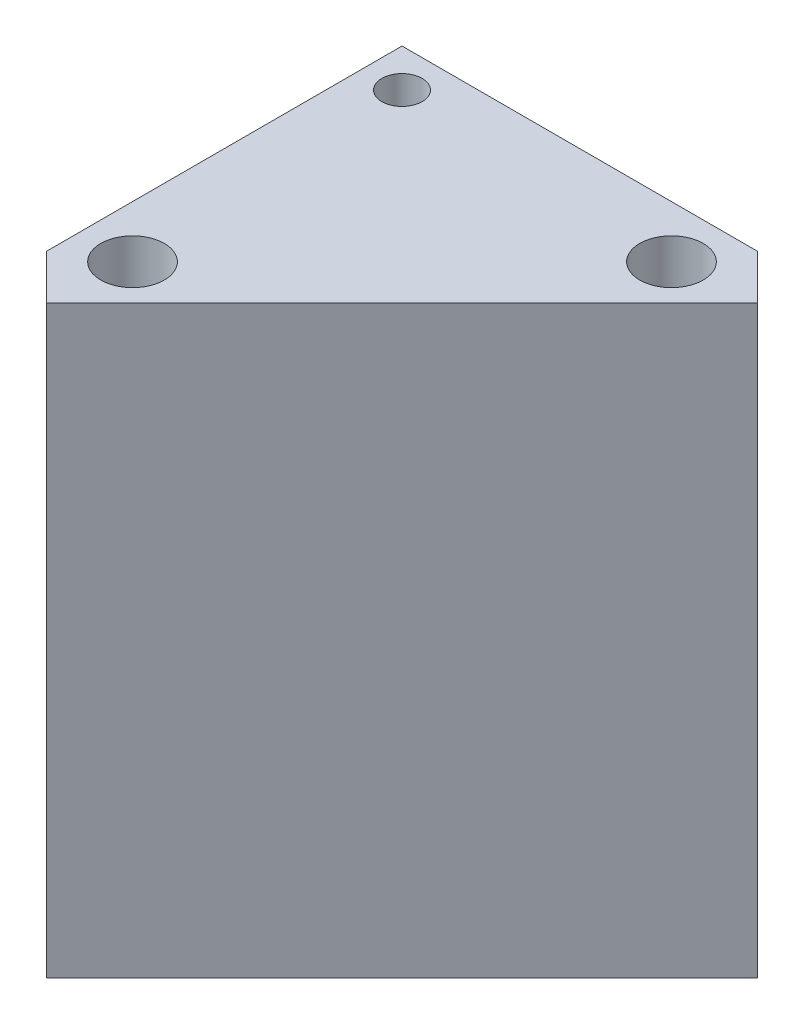
ISO-10303-21;
HEADER;
FILE_DESCRIPTION(('STEP AP214'),'2;1');
FILE_NAME('part.step','',(''),(''),'','','');
FILE_SCHEMA(('AUTOMOTIVE_DESIGN { 1 0 10303 214 1 1 1 1 }'));
ENDSEC;
DATA;
#1=APPLICATION_CONTEXT('core data for automotive mechanical design processes');
#2=APPLICATION_PROTOCOL_DEFINITION('international standard','automotive_design',2000,#1);
#3=PRODUCT_CONTEXT('',#1,'mechanical');
#4=PRODUCT('Part','Part','',(#3));
#5=PRODUCT_RELATED_PRODUCT_CATEGORY('part','',(#4));
#6=PRODUCT_DEFINITION_FORMATION('','',#4);
#7=PRODUCT_DEFINITION_CONTEXT('part definition',#1,'design');
#8=PRODUCT_DEFINITION('design','',#6,#7);
#9=PRODUCT_DEFINITION_SHAPE('','',#8);
#10=(LENGTH_UNIT() NAMED_UNIT(*) SI_UNIT(.MILLI.,.METRE.));
#11=(NAMED_UNIT(*) PLANE_ANGLE_UNIT() SI_UNIT($,.RADIAN.));
#12=(NAMED_UNIT(*) SI_UNIT($,.STERADIAN.) SOLID_ANGLE_UNIT());
#13=UNCERTAINTY_MEASURE_WITH_UNIT(LENGTH_MEASURE(1.E-05),#10,'distance_accuracy_value','');
#14=(GEOMETRIC_REPRESENTATION_CONTEXT(3) GLOBAL_UNCERTAINTY_ASSIGNED_CONTEXT((#13)) GLOBAL_UNIT_ASSIGNED_CONTEXT((#10,
#11,#12)) REPRESENTATION_CONTEXT('',''));
#15=CARTESIAN_POINT('',(0.,0.,0.));
#16=DIRECTION('',(0.,0.,1.));
#17=DIRECTION('',(1.,0.,0.));
#18=AXIS2_PLACEMENT_3D('',#15,#16,#17);
#19=CARTESIAN_POINT('',(0.,46.,0.));
#20=DIRECTION('',(0.,0.,1.));
#21=DIRECTION('',(1.,0.,0.));
#22=AXIS2_PLACEMENT_3D('',#19,#20,#21);
#23=PLANE('',#22);
#24=DIRECTION('',(0.,-1.,0.));
#25=VECTOR('',#24,1.);
#26=CARTESIAN_POINT('',(20.,41.,0.));
#27=LINE('',#26,#25);
#28=CARTESIAN_POINT('',(20.,41.,0.));
#29=VERTEX_POINT('',#28);
#30=CARTESIAN_POINT('',(20.,16.,0.));
#31=VERTEX_POINT('',#30);
#32=EDGE_CURVE('E322',#29,#31,#27,.T.);
#33=ORIENTED_EDGE('',*,*,#32,.F.);
#34=DIRECTION('',(1.,0.,0.));
#35=VECTOR('',#34,1.);
#36=CARTESIAN_POINT('',(0.,41.,0.));
#37=LINE('',#36,#35);
#38=CARTESIAN_POINT('',(0.,41.,0.));
#39=VERTEX_POINT('',#38);
#40=EDGE_CURVE('E313',#39,#29,#37,.T.);
#41=ORIENTED_EDGE('',*,*,#40,.F.);
#42=DIRECTION('',(0.,-1.,0.));
#43=VECTOR('',#42,1.);
#44=CARTESIAN_POINT('',(0.,46.,0.));
#45=LINE('',#44,#43);
#46=CARTESIAN_POINT('',(0.,46.,0.));
#47=VERTEX_POINT('',#46);
#48=EDGE_CURVE('E11',#47,#39,#45,.T.);
#49=ORIENTED_EDGE('',*,*,#48,.F.);
#50=DIRECTION('',(-1.,0.,0.));
#51=VECTOR('',#50,1.);
#52=CARTESIAN_POINT('',(0.,46.,0.));
#53=LINE('',#52,#51);
#54=CARTESIAN_POINT('',(28.,46.,0.));
#55=VERTEX_POINT('',#54);
#56=EDGE_CURVE('E131',#55,#47,#53,.T.);
#57=ORIENTED_EDGE('',*,*,#56,.F.);
#58=DIRECTION('',(0.,-1.,0.));
#59=VECTOR('',#58,1.);
#60=CARTESIAN_POINT('',(28.,46.,0.));
#61=LINE('',#60,#59);
#62=CARTESIAN_POINT('',(28.,0.,0.));
#63=VERTEX_POINT('',#62);
#64=EDGE_CURVE('E117',#55,#63,#61,.T.);
#65=ORIENTED_EDGE('',*,*,#64,.T.);
#66=DIRECTION('',(-1.,0.,0.));
#67=VECTOR('',#66,1.);
#68=CARTESIAN_POINT('',(0.,0.,0.));
#69=LINE('',#68,#67);
#70=CARTESIAN_POINT('',(0.,0.,0.));
#71=VERTEX_POINT('',#70);
#72=EDGE_CURVE('E121',#63,#71,#69,.T.);
#73=ORIENTED_EDGE('',*,*,#72,.T.);
#74=CARTESIAN_POINT('',(0.,16.,0.));
#75=VERTEX_POINT('',#74);
#76=EDGE_CURVE('E41',#75,#71,#45,.T.);
#77=ORIENTED_EDGE('',*,*,#76,.F.);
#78=DIRECTION('',(1.,0.,0.));
#79=VECTOR('',#78,1.);
#80=CARTESIAN_POINT('',(0.,16.,0.));
#81=LINE('',#80,#79);
#82=EDGE_CURVE('E48',#75,#31,#81,.T.);
#83=ORIENTED_EDGE('',*,*,#82,.T.);
#84=EDGE_LOOP('',(#33,#41,#49,#57,#65,#73,#77,#83));
#85=FACE_BOUND('',#84,.T.);
#86=ADVANCED_FACE('F33',(#85),#23,.F.);
#87=CARTESIAN_POINT('',(0.,46.,0.));
#88=DIRECTION('',(1.,0.,0.));
#89=DIRECTION('',(0.,0.,-1.));
#90=AXIS2_PLACEMENT_3D('',#87,#88,#89);
#91=PLANE('',#90);
#92=ORIENTED_EDGE('',*,*,#48,.T.);
#93=DIRECTION('',(0.,0.,-1.));
#94=VECTOR('',#93,1.);
#95=CARTESIAN_POINT('',(0.,41.,20.));
#96=LINE('',#95,#94);
#97=CARTESIAN_POINT('',(0.,41.,20.));
#98=VERTEX_POINT('',#97);
#99=EDGE_CURVE('E319',#98,#39,#96,.T.);
#100=ORIENTED_EDGE('',*,*,#99,.F.);
#101=DIRECTION('',(0.,-1.,0.));
#102=VECTOR('',#101,1.);
#103=CARTESIAN_POINT('',(0.,41.,20.));
#104=LINE('',#103,#102);
#105=CARTESIAN_POINT('',(0.,16.,20.));
#106=VERTEX_POINT('',#105);
#107=EDGE_CURVE('E125',#98,#106,#104,.T.);
#108=ORIENTED_EDGE('',*,*,#107,.T.);
#109=DIRECTION('',(0.,0.,-1.));
#110=VECTOR('',#109,1.);
#111=CARTESIAN_POINT('',(0.,16.,20.));
#112=LINE('',#111,#110);
#113=EDGE_CURVE('E138',#106,#75,#112,.T.);
#114=ORIENTED_EDGE('',*,*,#113,.T.);
#115=ORIENTED_EDGE('',*,*,#76,.T.);
#116=DIRECTION('',(0.,0.,1.));
#117=VECTOR('',#116,1.);
#118=CARTESIAN_POINT('',(0.,0.,0.));
#119=LINE('',#118,#117);
#120=CARTESIAN_POINT('',(0.,0.,28.));
#121=VERTEX_POINT('',#120);
#122=EDGE_CURVE('E124',#71,#121,#119,.T.);
#123=ORIENTED_EDGE('',*,*,#122,.T.);
#124=DIRECTION('',(0.,-1.,0.));
#125=VECTOR('',#124,1.);
#126=CARTESIAN_POINT('',(0.,46.,28.));
#127=LINE('',#126,#125);
#128=CARTESIAN_POINT('',(0.,46.,28.));
#129=VERTEX_POINT('',#128);
#130=EDGE_CURVE('E112',#129,#121,#127,.T.);
#131=ORIENTED_EDGE('',*,*,#130,.F.);
#132=DIRECTION('',(0.,0.,1.));
#133=VECTOR('',#132,1.);
#134=CARTESIAN_POINT('',(0.,46.,0.));
#135=LINE('',#134,#133);
#136=EDGE_CURVE('E89',#47,#129,#135,.T.);
#137=ORIENTED_EDGE('',*,*,#136,.F.);
#138=EDGE_LOOP('',(#92,#100,#108,#114,#115,#123,#131,#137));
#139=FACE_BOUND('',#138,.T.);
#140=ADVANCED_FACE('F136',(#139),#91,.F.);
#141=CARTESIAN_POINT('',(3.53553390593267,46.,31.5355339059327));
#142=DIRECTION('',(0.707106781186551,0.,-0.707106781186544));
#143=DIRECTION('',(-0.707106781186544,0.,-0.707106781186551));
#144=AXIS2_PLACEMENT_3D('',#141,#142,#143);
#145=PLANE('',#144);
#146=DIRECTION('',(0.707106781186544,0.,0.707106781186551));
#147=VECTOR('',#146,1.);
#148=CARTESIAN_POINT('',(3.53553390593267,0.,31.5355339059327));
#149=LINE('',#148,#147);
#150=CARTESIAN_POINT('',(3.53553390593267,0.,31.5355339059327));
#151=VERTEX_POINT('',#150);
#152=EDGE_CURVE('E109',#121,#151,#149,.T.);
#153=ORIENTED_EDGE('',*,*,#152,.T.);
#154=DIRECTION('',(0.,-1.,0.));
#155=VECTOR('',#154,1.);
#156=CARTESIAN_POINT('',(3.53553390593267,46.,31.5355339059327));
#157=LINE('',#156,#155);
#158=CARTESIAN_POINT('',(3.53553390593267,46.,31.5355339059327));
#159=VERTEX_POINT('',#158);
#160=EDGE_CURVE('E106',#159,#151,#157,.T.);
#161=ORIENTED_EDGE('',*,*,#160,.F.);
#162=DIRECTION('',(0.707106781186544,0.,0.707106781186551));
#163=VECTOR('',#162,1.);
#164=CARTESIAN_POINT('',(3.53553390593267,46.,31.5355339059327));
#165=LINE('',#164,#163);
#166=EDGE_CURVE('E96',#129,#159,#165,.T.);
#167=ORIENTED_EDGE('',*,*,#166,.F.);
#168=ORIENTED_EDGE('',*,*,#130,.T.);
#169=EDGE_LOOP('',(#153,#161,#167,#168));
#170=FACE_BOUND('',#169,.T.);
#171=ADVANCED_FACE('F107',(#170),#145,.F.);
#172=CARTESIAN_POINT('',(31.5355339059327,46.,3.53553390593274));
#173=DIRECTION('',(-0.707106781186546,0.,-0.707106781186549));
#174=DIRECTION('',(-0.707106781186549,0.,0.707106781186546));
#175=AXIS2_PLACEMENT_3D('',#172,#173,#174);
#176=PLANE('',#175);
#177=DIRECTION('',(0.707106781186549,0.,-0.707106781186546));
#178=VECTOR('',#177,1.);
#179=CARTESIAN_POINT('',(31.5355339059327,0.,3.53553390593274));
#180=LINE('',#179,#178);
#181=CARTESIAN_POINT('',(31.5355339059327,0.,3.53553390593274));
#182=VERTEX_POINT('',#181);
#183=EDGE_CURVE('E128',#151,#182,#180,.T.);
#184=ORIENTED_EDGE('',*,*,#183,.T.);
#185=DIRECTION('',(0.,-1.,0.));
#186=VECTOR('',#185,1.);
#187=CARTESIAN_POINT('',(31.5355339059327,46.,3.53553390593274));
#188=LINE('',#187,#186);
#189=CARTESIAN_POINT('',(31.5355339059327,46.,3.53553390593274));
#190=VERTEX_POINT('',#189);
#191=EDGE_CURVE('E113',#190,#182,#188,.T.);
#192=ORIENTED_EDGE('',*,*,#191,.F.);
#193=DIRECTION('',(0.707106781186549,0.,-0.707106781186546));
#194=VECTOR('',#193,1.);
#195=CARTESIAN_POINT('',(31.5355339059327,46.,3.53553390593274));
#196=LINE('',#195,#194);
#197=EDGE_CURVE('E100',#159,#190,#196,.T.);
#198=ORIENTED_EDGE('',*,*,#197,.F.);
#199=ORIENTED_EDGE('',*,*,#160,.T.);
#200=EDGE_LOOP('',(#184,#192,#198,#199));
#201=FACE_BOUND('',#200,.T.);
#202=ADVANCED_FACE('F115',(#201),#176,.F.);
#203=CARTESIAN_POINT('',(28.,46.,0.));
#204=DIRECTION('',(-0.707106781186548,0.,0.707106781186547));
#205=DIRECTION('',(0.707106781186547,0.,0.707106781186548));
#206=AXIS2_PLACEMENT_3D('',#203,#204,#205);
#207=PLANE('',#206);
#208=DIRECTION('',(-0.707106781186547,0.,-0.707106781186548));
#209=VECTOR('',#208,1.);
#210=CARTESIAN_POINT('',(28.,0.,0.));
#211=LINE('',#210,#209);
#212=EDGE_CURVE('E81',#182,#63,#211,.T.);
#213=ORIENTED_EDGE('',*,*,#212,.T.);
#214=ORIENTED_EDGE('',*,*,#64,.F.);
#215=DIRECTION('',(-0.707106781186547,0.,-0.707106781186548));
#216=VECTOR('',#215,1.);
#217=CARTESIAN_POINT('',(28.,46.,0.));
#218=LINE('',#217,#216);
#219=EDGE_CURVE('E57',#190,#55,#218,.T.);
#220=ORIENTED_EDGE('',*,*,#219,.F.);
#221=ORIENTED_EDGE('',*,*,#191,.T.);
#222=EDGE_LOOP('',(#213,#214,#220,#221));
#223=FACE_BOUND('',#222,.T.);
#224=ADVANCED_FACE('F146',(#223),#207,.F.);
#225=CARTESIAN_POINT('',(0.,46.,0.));
#226=DIRECTION('',(0.,-1.,0.));
#227=DIRECTION('',(0.,0.,-1.));
#228=AXIS2_PLACEMENT_3D('',#225,#226,#227);
#229=PLANE('',#228);
#230=CARTESIAN_POINT('',(4.10050506338827,46.,25.3137084989847));
#231=DIRECTION('',(0.,1.,0.));
#232=DIRECTION('',(0.,0.,-1.));
#233=AXIS2_PLACEMENT_3D('',#230,#231,#232);
#234=CIRCLE('',#233,2.5);
#235=CARTESIAN_POINT('',(4.10050506338827,46.,22.8137084989847));
#236=VERTEX_POINT('',#235);
#237=EDGE_CURVE('E294',#236,#236,#234,.T.);
#238=ORIENTED_EDGE('',*,*,#237,.F.);
#239=EDGE_LOOP('',(#238));
#240=FACE_BOUND('',#239,.T.);
#241=CARTESIAN_POINT('',(25.3137084989847,46.,4.1005050633883));
#242=DIRECTION('',(0.,1.,0.));
#243=DIRECTION('',(0.,0.,1.));
#244=AXIS2_PLACEMENT_3D('',#241,#242,#243);
#245=CIRCLE('',#244,2.5);
#246=CARTESIAN_POINT('',(25.3137084989847,46.,6.6005050633883));
#247=VERTEX_POINT('',#246);
#248=EDGE_CURVE('E293',#247,#247,#245,.T.);
#249=ORIENTED_EDGE('',*,*,#248,.F.);
#250=EDGE_LOOP('',(#249));
#251=FACE_BOUND('',#250,.T.);
#252=CARTESIAN_POINT('',(3.,46.,3.));
#253=DIRECTION('',(0.,1.,0.));
#254=DIRECTION('',(0.,0.,1.));
#255=AXIS2_PLACEMENT_3D('',#252,#253,#254);
#256=CIRCLE('',#255,1.5875);
#257=CARTESIAN_POINT('',(3.,46.,4.5875));
#258=VERTEX_POINT('',#257);
#259=EDGE_CURVE('E303',#258,#258,#256,.T.);
#260=ORIENTED_EDGE('',*,*,#259,.F.);
#261=EDGE_LOOP('',(#260));
#262=FACE_BOUND('',#261,.T.);
#263=ORIENTED_EDGE('',*,*,#56,.T.);
#264=ORIENTED_EDGE('',*,*,#136,.T.);
#265=ORIENTED_EDGE('',*,*,#166,.T.);
#266=ORIENTED_EDGE('',*,*,#197,.T.);
#267=ORIENTED_EDGE('',*,*,#219,.T.);
#268=EDGE_LOOP('',(#263,#264,#265,#266,#267));
#269=FACE_BOUND('',#268,.T.);
#270=ADVANCED_FACE('F98',(#240,#251,#262,#269),#229,.F.);
#271=CARTESIAN_POINT('',(0.,0.,0.));
#272=DIRECTION('',(0.,-1.,0.));
#273=DIRECTION('',(0.,0.,-1.));
#274=AXIS2_PLACEMENT_3D('',#271,#272,#273);
#275=PLANE('',#274);
#276=CARTESIAN_POINT('',(3.,0.,3.));
#277=DIRECTION('',(0.,1.,0.));
#278=DIRECTION('',(0.,0.,1.));
#279=AXIS2_PLACEMENT_3D('',#276,#277,#278);
#280=CIRCLE('',#279,1.5875);
#281=CARTESIAN_POINT('',(3.,0.,4.5875));
#282=VERTEX_POINT('',#281);
#283=EDGE_CURVE('E305',#282,#282,#280,.T.);
#284=ORIENTED_EDGE('',*,*,#283,.T.);
#285=EDGE_LOOP('',(#284));
#286=FACE_BOUND('',#285,.T.);
#287=ORIENTED_EDGE('',*,*,#72,.F.);
#288=ORIENTED_EDGE('',*,*,#212,.F.);
#289=ORIENTED_EDGE('',*,*,#183,.F.);
#290=ORIENTED_EDGE('',*,*,#152,.F.);
#291=ORIENTED_EDGE('',*,*,#122,.F.);
#292=EDGE_LOOP('',(#287,#288,#289,#290,#291));
#293=FACE_BOUND('',#292,.T.);
#294=ADVANCED_FACE('F142',(#286,#293),#275,.T.);
#295=CARTESIAN_POINT('',(0.,41.,0.));
#296=DIRECTION('',(0.,-1.,0.));
#297=DIRECTION('',(0.,0.,-1.));
#298=AXIS2_PLACEMENT_3D('',#295,#296,#297);
#299=CYLINDRICAL_SURFACE('',#298,20.);
#300=CARTESIAN_POINT('',(0.,16.,0.));
#301=DIRECTION('',(0.,-1.,0.));
#302=DIRECTION('',(0.,0.,1.));
#303=AXIS2_PLACEMENT_3D('',#300,#301,#302);
#304=CIRCLE('',#303,20.);
#305=EDGE_CURVE('E324',#31,#106,#304,.T.);
#306=ORIENTED_EDGE('',*,*,#305,.T.);
#307=ORIENTED_EDGE('',*,*,#107,.F.);
#308=CARTESIAN_POINT('',(0.,41.,0.));
#309=DIRECTION('',(0.,-1.,0.));
#310=DIRECTION('',(0.,0.,1.));
#311=AXIS2_PLACEMENT_3D('',#308,#309,#310);
#312=CIRCLE('',#311,20.);
#313=EDGE_CURVE('E316',#29,#98,#312,.T.);
#314=ORIENTED_EDGE('',*,*,#313,.F.);
#315=ORIENTED_EDGE('',*,*,#32,.T.);
#316=EDGE_LOOP('',(#306,#307,#314,#315));
#317=FACE_BOUND('',#316,.T.);
#318=ADVANCED_FACE('F189',(#317),#299,.F.);
#319=CARTESIAN_POINT('',(0.,41.,0.));
#320=DIRECTION('',(0.,1.,0.));
#321=DIRECTION('',(0.,0.,1.));
#322=AXIS2_PLACEMENT_3D('',#319,#320,#321);
#323=PLANE('',#322);
#324=CARTESIAN_POINT('',(3.,41.,3.));
#325=DIRECTION('',(0.,1.,0.));
#326=DIRECTION('',(0.,0.,1.));
#327=AXIS2_PLACEMENT_3D('',#324,#325,#326);
#328=CIRCLE('',#327,1.5875);
#329=CARTESIAN_POINT('',(3.,41.,4.5875));
#330=VERTEX_POINT('',#329);
#331=EDGE_CURVE('E310',#330,#330,#328,.T.);
#332=ORIENTED_EDGE('',*,*,#331,.T.);
#333=EDGE_LOOP('',(#332));
#334=FACE_BOUND('',#333,.T.);
#335=ORIENTED_EDGE('',*,*,#40,.T.);
#336=ORIENTED_EDGE('',*,*,#313,.T.);
#337=ORIENTED_EDGE('',*,*,#99,.T.);
#338=EDGE_LOOP('',(#335,#336,#337));
#339=FACE_BOUND('',#338,.T.);
#340=ADVANCED_FACE('F194',(#334,#339),#323,.F.);
#341=CARTESIAN_POINT('',(0.,16.,0.));
#342=DIRECTION('',(0.,1.,0.));
#343=DIRECTION('',(0.,0.,1.));
#344=AXIS2_PLACEMENT_3D('',#341,#342,#343);
#345=PLANE('',#344);
#346=CARTESIAN_POINT('',(3.,16.,3.));
#347=DIRECTION('',(0.,1.,0.));
#348=DIRECTION('',(0.,0.,1.));
#349=AXIS2_PLACEMENT_3D('',#346,#347,#348);
#350=CIRCLE('',#349,1.5875);
#351=CARTESIAN_POINT('',(3.,16.,4.5875));
#352=VERTEX_POINT('',#351);
#353=EDGE_CURVE('E36',#352,#352,#350,.T.);
#354=ORIENTED_EDGE('',*,*,#353,.F.);
#355=EDGE_LOOP('',(#354));
#356=FACE_BOUND('',#355,.T.);
#357=ORIENTED_EDGE('',*,*,#82,.F.);
#358=ORIENTED_EDGE('',*,*,#113,.F.);
#359=ORIENTED_EDGE('',*,*,#305,.F.);
#360=EDGE_LOOP('',(#357,#358,#359));
#361=FACE_BOUND('',#360,.T.);
#362=ADVANCED_FACE('F212',(#356,#361),#345,.T.);
#363=CARTESIAN_POINT('',(3.,0.,3.));
#364=DIRECTION('',(0.,1.,0.));
#365=DIRECTION('',(0.,0.,1.));
#366=AXIS2_PLACEMENT_3D('',#363,#364,#365);
#367=CYLINDRICAL_SURFACE('',#366,1.5875);
#368=ORIENTED_EDGE('',*,*,#353,.T.);
#369=EDGE_LOOP('',(#368));
#370=FACE_BOUND('',#369,.T.);
#371=ORIENTED_EDGE('',*,*,#283,.F.);
#372=EDGE_LOOP('',(#371));
#373=FACE_BOUND('',#372,.T.);
#374=ADVANCED_FACE('F222',(#370,#373),#367,.F.);
#375=ORIENTED_EDGE('',*,*,#259,.T.);
#376=EDGE_LOOP('',(#375));
#377=FACE_BOUND('',#376,.T.);
#378=ORIENTED_EDGE('',*,*,#331,.F.);
#379=EDGE_LOOP('',(#378));
#380=FACE_BOUND('',#379,.T.);
#381=ADVANCED_FACE('F232',(#377,#380),#367,.F.);
#382=CARTESIAN_POINT('',(25.3137084989847,36.,4.1005050633883));
#383=DIRECTION('',(0.,1.,0.));
#384=DIRECTION('',(0.,0.,1.));
#385=AXIS2_PLACEMENT_3D('',#382,#383,#384);
#386=CYLINDRICAL_SURFACE('',#385,2.5);
#387=CARTESIAN_POINT('',(25.3137084989847,36.,4.1005050633883));
#388=DIRECTION('',(0.,1.,0.));
#389=DIRECTION('',(0.,0.,1.));
#390=AXIS2_PLACEMENT_3D('',#387,#388,#389);
#391=CIRCLE('',#390,2.5);
#392=CARTESIAN_POINT('',(25.3137084989847,36.,6.6005050633883));
#393=VERTEX_POINT('',#392);
#394=EDGE_CURVE('E297',#393,#393,#391,.T.);
#395=ORIENTED_EDGE('',*,*,#394,.F.);
#396=EDGE_LOOP('',(#395));
#397=FACE_BOUND('',#396,.T.);
#398=ORIENTED_EDGE('',*,*,#248,.T.);
#399=EDGE_LOOP('',(#398));
#400=FACE_BOUND('',#399,.T.);
#401=ADVANCED_FACE('F242',(#397,#400),#386,.F.);
#402=CARTESIAN_POINT('',(25.3137084989847,36.,4.1005050633883));
#403=DIRECTION('',(0.,1.,0.));
#404=DIRECTION('',(0.,0.,1.));
#405=AXIS2_PLACEMENT_3D('',#402,#403,#404);
#406=PLANE('',#405);
#407=ORIENTED_EDGE('',*,*,#394,.T.);
#408=EDGE_LOOP('',(#407));
#409=FACE_BOUND('',#408,.T.);
#410=ADVANCED_FACE('F256',(#409),#406,.T.);
#411=CARTESIAN_POINT('',(4.10050506338827,36.,25.3137084989847));
#412=DIRECTION('',(0.,1.,0.));
#413=DIRECTION('',(0.,0.,1.));
#414=AXIS2_PLACEMENT_3D('',#411,#412,#413);
#415=CYLINDRICAL_SURFACE('',#414,2.5);
#416=CARTESIAN_POINT('',(4.10050506338827,36.,25.3137084989847));
#417=DIRECTION('',(0.,1.,0.));
#418=DIRECTION('',(0.,0.,-1.));
#419=AXIS2_PLACEMENT_3D('',#416,#417,#418);
#420=CIRCLE('',#419,2.5);
#421=CARTESIAN_POINT('',(4.10050506338827,36.,22.8137084989847));
#422=VERTEX_POINT('',#421);
#423=EDGE_CURVE('E292',#422,#422,#420,.T.);
#424=ORIENTED_EDGE('',*,*,#423,.F.);
#425=EDGE_LOOP('',(#424));
#426=FACE_BOUND('',#425,.T.);
#427=ORIENTED_EDGE('',*,*,#237,.T.);
#428=EDGE_LOOP('',(#427));
#429=FACE_BOUND('',#428,.T.);
#430=ADVANCED_FACE('F266',(#426,#429),#415,.F.);
#431=CARTESIAN_POINT('',(4.10050506338827,36.,25.3137084989847));
#432=DIRECTION('',(0.,-1.,0.));
#433=DIRECTION('',(0.,0.,-1.));
#434=AXIS2_PLACEMENT_3D('',#431,#432,#433);
#435=PLANE('',#434);
#436=ORIENTED_EDGE('',*,*,#423,.T.);
#437=EDGE_LOOP('',(#436));
#438=FACE_BOUND('',#437,.T.);
#439=ADVANCED_FACE('F276',(#438),#435,.F.);
#440=CLOSED_SHELL('',(#86,#140,#171,#202,#224,#270,#294,#318,#340,#362,#374,#381,#401,#410,#430,#439));
#441=MANIFOLD_SOLID_BREP('B2',#440);
#442=ADVANCED_BREP_SHAPE_REPRESENTATION('',(#18,#441),#14);
#443=SHAPE_DEFINITION_REPRESENTATION(#9,#442);
ENDSEC;
END-ISO-10303-21;
